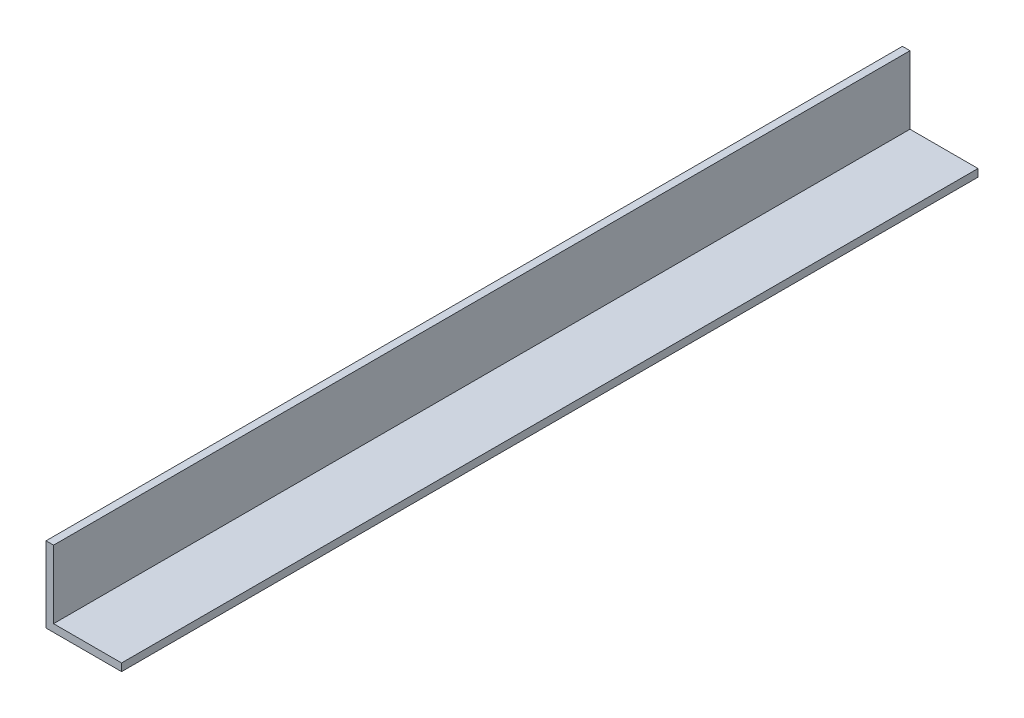
ISO-10303-21;
HEADER;
FILE_DESCRIPTION(('STEP AP214'),'2;1');
FILE_NAME('part.step','',(''),(''),'','','');
FILE_SCHEMA(('AUTOMOTIVE_DESIGN { 1 0 10303 214 1 1 1 1 }'));
ENDSEC;
DATA;
#1=APPLICATION_CONTEXT('core data for automotive mechanical design processes');
#2=APPLICATION_PROTOCOL_DEFINITION('international standard','automotive_design',2000,#1);
#3=PRODUCT_CONTEXT('',#1,'mechanical');
#4=PRODUCT('Part','Part','',(#3));
#5=PRODUCT_RELATED_PRODUCT_CATEGORY('part','',(#4));
#6=PRODUCT_DEFINITION_FORMATION('','',#4);
#7=PRODUCT_DEFINITION_CONTEXT('part definition',#1,'design');
#8=PRODUCT_DEFINITION('design','',#6,#7);
#9=PRODUCT_DEFINITION_SHAPE('','',#8);
#10=(LENGTH_UNIT() NAMED_UNIT(*) SI_UNIT(.MILLI.,.METRE.));
#11=(NAMED_UNIT(*) PLANE_ANGLE_UNIT() SI_UNIT($,.RADIAN.));
#12=(NAMED_UNIT(*) SI_UNIT($,.STERADIAN.) SOLID_ANGLE_UNIT());
#13=UNCERTAINTY_MEASURE_WITH_UNIT(LENGTH_MEASURE(1.E-05),#10,'distance_accuracy_value','');
#14=(GEOMETRIC_REPRESENTATION_CONTEXT(3) GLOBAL_UNCERTAINTY_ASSIGNED_CONTEXT((#13)) GLOBAL_UNIT_ASSIGNED_CONTEXT((#10,
#11,#12)) REPRESENTATION_CONTEXT('',''));
#15=CARTESIAN_POINT('',(0.,0.,0.));
#16=DIRECTION('',(0.,0.,1.));
#17=DIRECTION('',(1.,0.,0.));
#18=AXIS2_PLACEMENT_3D('',#15,#16,#17);
#19=CARTESIAN_POINT('',(3.,30.,340.));
#20=DIRECTION('',(0.,-1.,0.));
#21=DIRECTION('',(0.,0.,-1.));
#22=AXIS2_PLACEMENT_3D('',#19,#20,#21);
#23=PLANE('',#22);
#24=DIRECTION('',(-1.,0.,0.));
#25=VECTOR('',#24,1.);
#26=CARTESIAN_POINT('',(3.,30.,0.));
#27=LINE('',#26,#25);
#28=CARTESIAN_POINT('',(3.,30.,0.));
#29=VERTEX_POINT('',#28);
#30=CARTESIAN_POINT('',(0.,30.,0.));
#31=VERTEX_POINT('',#30);
#32=EDGE_CURVE('E117',#29,#31,#27,.T.);
#33=ORIENTED_EDGE('',*,*,#32,.T.);
#34=DIRECTION('',(0.,0.,-1.));
#35=VECTOR('',#34,1.);
#36=CARTESIAN_POINT('',(0.,30.,340.));
#37=LINE('',#36,#35);
#38=CARTESIAN_POINT('',(0.,30.,340.));
#39=VERTEX_POINT('',#38);
#40=EDGE_CURVE('E11',#39,#31,#37,.T.);
#41=ORIENTED_EDGE('',*,*,#40,.F.);
#42=DIRECTION('',(-1.,0.,0.));
#43=VECTOR('',#42,1.);
#44=CARTESIAN_POINT('',(3.,30.,340.));
#45=LINE('',#44,#43);
#46=CARTESIAN_POINT('',(3.,30.,340.));
#47=VERTEX_POINT('',#46);
#48=EDGE_CURVE('E127',#47,#39,#45,.T.);
#49=ORIENTED_EDGE('',*,*,#48,.F.);
#50=DIRECTION('',(0.,0.,-1.));
#51=VECTOR('',#50,1.);
#52=CARTESIAN_POINT('',(3.,30.,340.));
#53=LINE('',#52,#51);
#54=EDGE_CURVE('E113',#47,#29,#53,.T.);
#55=ORIENTED_EDGE('',*,*,#54,.T.);
#56=EDGE_LOOP('',(#33,#41,#49,#55));
#57=FACE_BOUND('',#56,.T.);
#58=ADVANCED_FACE('F33',(#57),#23,.F.);
#59=CARTESIAN_POINT('',(0.,30.,340.));
#60=DIRECTION('',(1.,0.,0.));
#61=DIRECTION('',(0.,0.,-1.));
#62=AXIS2_PLACEMENT_3D('',#59,#60,#61);
#63=PLANE('',#62);
#64=DIRECTION('',(0.,-1.,0.));
#65=VECTOR('',#64,1.);
#66=CARTESIAN_POINT('',(0.,30.,0.));
#67=LINE('',#66,#65);
#68=CARTESIAN_POINT('',(0.,0.,0.));
#69=VERTEX_POINT('',#68);
#70=EDGE_CURVE('E120',#31,#69,#67,.T.);
#71=ORIENTED_EDGE('',*,*,#70,.T.);
#72=DIRECTION('',(0.,0.,-1.));
#73=VECTOR('',#72,1.);
#74=CARTESIAN_POINT('',(0.,0.,340.));
#75=LINE('',#74,#73);
#76=CARTESIAN_POINT('',(0.,0.,340.));
#77=VERTEX_POINT('',#76);
#78=EDGE_CURVE('E41',#77,#69,#75,.T.);
#79=ORIENTED_EDGE('',*,*,#78,.F.);
#80=DIRECTION('',(0.,-1.,0.));
#81=VECTOR('',#80,1.);
#82=CARTESIAN_POINT('',(0.,30.,340.));
#83=LINE('',#82,#81);
#84=EDGE_CURVE('E86',#39,#77,#83,.T.);
#85=ORIENTED_EDGE('',*,*,#84,.F.);
#86=ORIENTED_EDGE('',*,*,#40,.T.);
#87=EDGE_LOOP('',(#71,#79,#85,#86));
#88=FACE_BOUND('',#87,.T.);
#89=ADVANCED_FACE('F151',(#88),#63,.F.);
#90=CARTESIAN_POINT('',(0.,0.,340.));
#91=DIRECTION('',(0.,1.,0.));
#92=DIRECTION('',(0.,0.,1.));
#93=AXIS2_PLACEMENT_3D('',#90,#91,#92);
#94=PLANE('',#93);
#95=DIRECTION('',(1.,0.,0.));
#96=VECTOR('',#95,1.);
#97=CARTESIAN_POINT('',(0.,0.,0.));
#98=LINE('',#97,#96);
#99=CARTESIAN_POINT('',(30.,0.,0.));
#100=VERTEX_POINT('',#99);
#101=EDGE_CURVE('E122',#69,#100,#98,.T.);
#102=ORIENTED_EDGE('',*,*,#101,.T.);
#103=DIRECTION('',(0.,0.,-1.));
#104=VECTOR('',#103,1.);
#105=CARTESIAN_POINT('',(30.,0.,340.));
#106=LINE('',#105,#104);
#107=CARTESIAN_POINT('',(30.,0.,340.));
#108=VERTEX_POINT('',#107);
#109=EDGE_CURVE('E108',#108,#100,#106,.T.);
#110=ORIENTED_EDGE('',*,*,#109,.F.);
#111=DIRECTION('',(1.,0.,0.));
#112=VECTOR('',#111,1.);
#113=CARTESIAN_POINT('',(0.,0.,340.));
#114=LINE('',#113,#112);
#115=EDGE_CURVE('E99',#77,#108,#114,.T.);
#116=ORIENTED_EDGE('',*,*,#115,.F.);
#117=ORIENTED_EDGE('',*,*,#78,.T.);
#118=EDGE_LOOP('',(#102,#110,#116,#117));
#119=FACE_BOUND('',#118,.T.);
#120=ADVANCED_FACE('F133',(#119),#94,.F.);
#121=CARTESIAN_POINT('',(30.,0.,340.));
#122=DIRECTION('',(-1.,0.,0.));
#123=DIRECTION('',(0.,0.,1.));
#124=AXIS2_PLACEMENT_3D('',#121,#122,#123);
#125=PLANE('',#124);
#126=DIRECTION('',(0.,1.,0.));
#127=VECTOR('',#126,1.);
#128=CARTESIAN_POINT('',(30.,0.,0.));
#129=LINE('',#128,#127);
#130=CARTESIAN_POINT('',(30.,3.,0.));
#131=VERTEX_POINT('',#130);
#132=EDGE_CURVE('E107',#100,#131,#129,.T.);
#133=ORIENTED_EDGE('',*,*,#132,.T.);
#134=DIRECTION('',(0.,0.,-1.));
#135=VECTOR('',#134,1.);
#136=CARTESIAN_POINT('',(30.,3.,340.));
#137=LINE('',#136,#135);
#138=CARTESIAN_POINT('',(30.,3.,340.));
#139=VERTEX_POINT('',#138);
#140=EDGE_CURVE('E104',#139,#131,#137,.T.);
#141=ORIENTED_EDGE('',*,*,#140,.F.);
#142=DIRECTION('',(0.,1.,0.));
#143=VECTOR('',#142,1.);
#144=CARTESIAN_POINT('',(30.,0.,340.));
#145=LINE('',#144,#143);
#146=EDGE_CURVE('E93',#108,#139,#145,.T.);
#147=ORIENTED_EDGE('',*,*,#146,.F.);
#148=ORIENTED_EDGE('',*,*,#109,.T.);
#149=EDGE_LOOP('',(#133,#141,#147,#148));
#150=FACE_BOUND('',#149,.T.);
#151=ADVANCED_FACE('F105',(#150),#125,.F.);
#152=CARTESIAN_POINT('',(30.,3.,340.));
#153=DIRECTION('',(0.,-1.,0.));
#154=DIRECTION('',(1.,0.,0.));
#155=AXIS2_PLACEMENT_3D('',#152,#153,#154);
#156=PLANE('',#155);
#157=DIRECTION('',(-1.,0.,0.));
#158=VECTOR('',#157,1.);
#159=CARTESIAN_POINT('',(30.,3.,0.));
#160=LINE('',#159,#158);
#161=CARTESIAN_POINT('',(3.,3.,0.));
#162=VERTEX_POINT('',#161);
#163=EDGE_CURVE('E72',#131,#162,#160,.T.);
#164=ORIENTED_EDGE('',*,*,#163,.T.);
#165=DIRECTION('',(0.,0.,-1.));
#166=VECTOR('',#165,1.);
#167=CARTESIAN_POINT('',(3.,3.,340.));
#168=LINE('',#167,#166);
#169=CARTESIAN_POINT('',(3.,3.,340.));
#170=VERTEX_POINT('',#169);
#171=EDGE_CURVE('E109',#170,#162,#168,.T.);
#172=ORIENTED_EDGE('',*,*,#171,.F.);
#173=DIRECTION('',(-1.,0.,0.));
#174=VECTOR('',#173,1.);
#175=CARTESIAN_POINT('',(30.,3.,340.));
#176=LINE('',#175,#174);
#177=EDGE_CURVE('E97',#139,#170,#176,.T.);
#178=ORIENTED_EDGE('',*,*,#177,.F.);
#179=ORIENTED_EDGE('',*,*,#140,.T.);
#180=EDGE_LOOP('',(#164,#172,#178,#179));
#181=FACE_BOUND('',#180,.T.);
#182=ADVANCED_FACE('F111',(#181),#156,.F.);
#183=CARTESIAN_POINT('',(3.,3.,340.));
#184=DIRECTION('',(-1.,0.,0.));
#185=DIRECTION('',(0.,0.,1.));
#186=AXIS2_PLACEMENT_3D('',#183,#184,#185);
#187=PLANE('',#186);
#188=DIRECTION('',(0.,1.,0.));
#189=VECTOR('',#188,1.);
#190=CARTESIAN_POINT('',(3.,3.,0.));
#191=LINE('',#190,#189);
#192=EDGE_CURVE('E78',#162,#29,#191,.T.);
#193=ORIENTED_EDGE('',*,*,#192,.T.);
#194=ORIENTED_EDGE('',*,*,#54,.F.);
#195=DIRECTION('',(0.,1.,0.));
#196=VECTOR('',#195,1.);
#197=CARTESIAN_POINT('',(3.,3.,340.));
#198=LINE('',#197,#196);
#199=EDGE_CURVE('E49',#170,#47,#198,.T.);
#200=ORIENTED_EDGE('',*,*,#199,.F.);
#201=ORIENTED_EDGE('',*,*,#171,.T.);
#202=EDGE_LOOP('',(#193,#194,#200,#201));
#203=FACE_BOUND('',#202,.T.);
#204=ADVANCED_FACE('F140',(#203),#187,.F.);
#205=CARTESIAN_POINT('',(0.,0.,340.));
#206=DIRECTION('',(0.,0.,1.));
#207=DIRECTION('',(1.,0.,0.));
#208=AXIS2_PLACEMENT_3D('',#205,#206,#207);
#209=PLANE('',#208);
#210=ORIENTED_EDGE('',*,*,#48,.T.);
#211=ORIENTED_EDGE('',*,*,#84,.T.);
#212=ORIENTED_EDGE('',*,*,#115,.T.);
#213=ORIENTED_EDGE('',*,*,#146,.T.);
#214=ORIENTED_EDGE('',*,*,#177,.T.);
#215=ORIENTED_EDGE('',*,*,#199,.T.);
#216=EDGE_LOOP('',(#210,#211,#212,#213,#214,#215));
#217=FACE_BOUND('',#216,.T.);
#218=ADVANCED_FACE('F95',(#217),#209,.T.);
#219=CARTESIAN_POINT('',(0.,0.,0.));
#220=DIRECTION('',(0.,0.,1.));
#221=DIRECTION('',(1.,0.,0.));
#222=AXIS2_PLACEMENT_3D('',#219,#220,#221);
#223=PLANE('',#222);
#224=ORIENTED_EDGE('',*,*,#32,.F.);
#225=ORIENTED_EDGE('',*,*,#192,.F.);
#226=ORIENTED_EDGE('',*,*,#163,.F.);
#227=ORIENTED_EDGE('',*,*,#132,.F.);
#228=ORIENTED_EDGE('',*,*,#101,.F.);
#229=ORIENTED_EDGE('',*,*,#70,.F.);
#230=EDGE_LOOP('',(#224,#225,#226,#227,#228,#229));
#231=FACE_BOUND('',#230,.T.);
#232=ADVANCED_FACE('F136',(#231),#223,.F.);
#233=CLOSED_SHELL('',(#58,#89,#120,#151,#182,#204,#218,#232));
#234=MANIFOLD_SOLID_BREP('B2',#233);
#235=ADVANCED_BREP_SHAPE_REPRESENTATION('',(#18,#234),#14);
#236=SHAPE_DEFINITION_REPRESENTATION(#9,#235);
ENDSEC;
END-ISO-10303-21;
